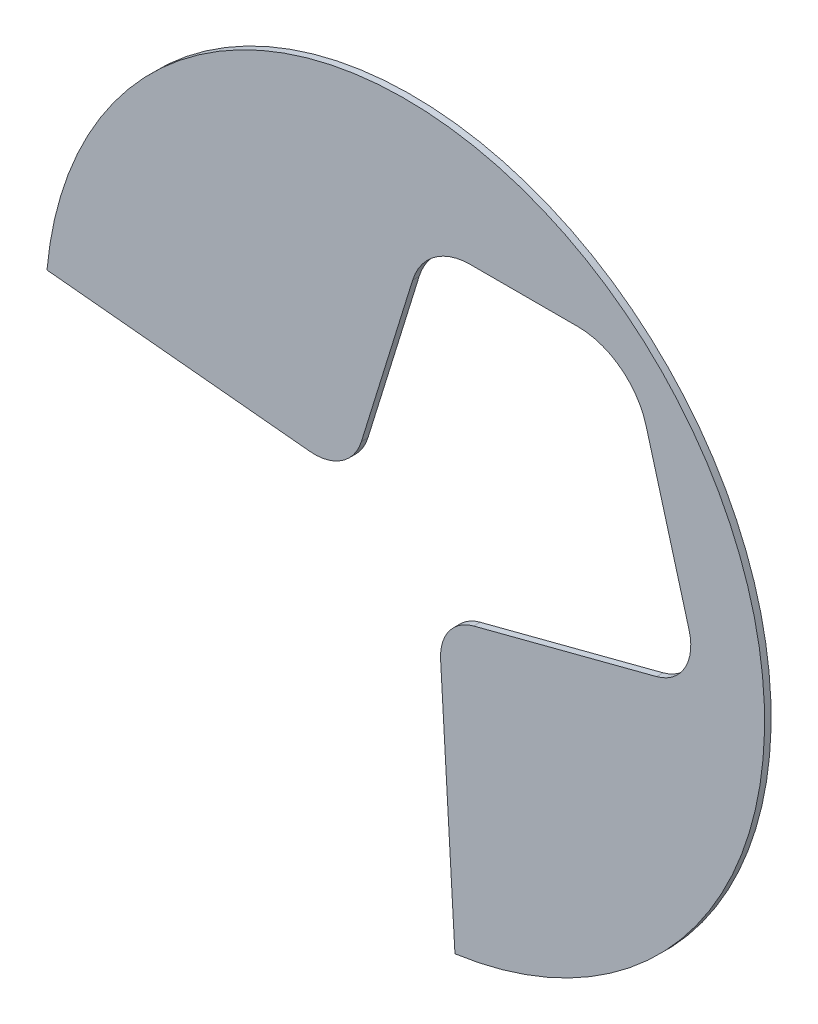
ISO-10303-21;
HEADER;
FILE_DESCRIPTION(('STEP AP214'),'2;1');
FILE_NAME('part.step','',(''),(''),'','','');
FILE_SCHEMA(('AUTOMOTIVE_DESIGN { 1 0 10303 214 1 1 1 1 }'));
ENDSEC;
DATA;
#1=APPLICATION_CONTEXT('core data for automotive mechanical design processes');
#2=APPLICATION_PROTOCOL_DEFINITION('international standard','automotive_design',2000,#1);
#3=PRODUCT_CONTEXT('',#1,'mechanical');
#4=PRODUCT('Part','Part','',(#3));
#5=PRODUCT_RELATED_PRODUCT_CATEGORY('part','',(#4));
#6=PRODUCT_DEFINITION_FORMATION('','',#4);
#7=PRODUCT_DEFINITION_CONTEXT('part definition',#1,'design');
#8=PRODUCT_DEFINITION('design','',#6,#7);
#9=PRODUCT_DEFINITION_SHAPE('','',#8);
#10=(LENGTH_UNIT() NAMED_UNIT(*) SI_UNIT(.MILLI.,.METRE.));
#11=(NAMED_UNIT(*) PLANE_ANGLE_UNIT() SI_UNIT($,.RADIAN.));
#12=(NAMED_UNIT(*) SI_UNIT($,.STERADIAN.) SOLID_ANGLE_UNIT());
#13=UNCERTAINTY_MEASURE_WITH_UNIT(LENGTH_MEASURE(1.E-05),#10,'distance_accuracy_value','');
#14=(GEOMETRIC_REPRESENTATION_CONTEXT(3) GLOBAL_UNCERTAINTY_ASSIGNED_CONTEXT((#13)) GLOBAL_UNIT_ASSIGNED_CONTEXT((#10,
#11,#12)) REPRESENTATION_CONTEXT('',''));
#15=CARTESIAN_POINT('',(0.,0.,0.));
#16=DIRECTION('',(0.,0.,1.));
#17=DIRECTION('',(1.,0.,0.));
#18=AXIS2_PLACEMENT_3D('',#15,#16,#17);
#19=CARTESIAN_POINT('',(1.415323871833,-20.5614263911,0.01));
#20=DIRECTION('',(0.,0.,1.));
#21=DIRECTION('',(1.,0.,0.));
#22=AXIS2_PLACEMENT_3D('',#19,#20,#21);
#23=PLANE('',#22);
#24=CARTESIAN_POINT('',(1.447148092672,-20.80032690544,0.01));
#25=DIRECTION('',(0.,0.,1.));
#26=DIRECTION('',(1.,0.,0.));
#27=AXIS2_PLACEMENT_3D('',#24,#25,#26);
#28=CIRCLE('',#27,0.0677382198574);
#29=CARTESIAN_POINT('',(1.4300742619,-20.73477577477,0.01));
#30=VERTEX_POINT('',#29);
#31=CARTESIAN_POINT('',(1.379523394206,-20.80424692926,0.01));
#32=VERTEX_POINT('',#31);
#33=EDGE_CURVE('E150',#30,#32,#28,.T.);
#34=ORIENTED_EDGE('',*,*,#33,.T.);
#35=DIRECTION('',(-0.0578701925266239,0.998324116115068,0.));
#36=VECTOR('',#35,1.);
#37=CARTESIAN_POINT('',(1.40147469185,-21.18293082266,0.01));
#38=LINE('',#37,#36);
#39=CARTESIAN_POINT('',(1.40147469185,-21.18293082266,0.01));
#40=VERTEX_POINT('',#39);
#41=EDGE_CURVE('E181',#40,#32,#38,.T.);
#42=ORIENTED_EDGE('',*,*,#41,.F.);
#43=CARTESIAN_POINT('',(1.325239510182,-20.63879433854,0.01));
#44=DIRECTION('',(0.,0.,1.));
#45=DIRECTION('',(1.,0.,0.));
#46=AXIS2_PLACEMENT_3D('',#43,#44,#45);
#47=CIRCLE('',#46,0.549450922539);
#48=CARTESIAN_POINT('',(0.777986222644,-20.58970100338,0.01));
#49=VERTEX_POINT('',#48);
#50=EDGE_CURVE('E197',#40,#49,#47,.T.);
#51=ORIENTED_EDGE('',*,*,#50,.T.);
#52=DIRECTION('',(0.995287122010985,-0.0969718761244285,0.));
#53=VECTOR('',#52,1.);
#54=CARTESIAN_POINT('',(0.777986222644,-20.58970100338,0.01));
#55=LINE('',#54,#53);
#56=CARTESIAN_POINT('',(1.179742413252,-20.62884453361,0.01));
#57=VERTEX_POINT('',#56);
#58=EDGE_CURVE('E159',#49,#57,#55,.T.);
#59=ORIENTED_EDGE('',*,*,#58,.T.);
#60=CARTESIAN_POINT('',(1.186997900889,-20.55437661881,0.01));
#61=DIRECTION('',(0.,0.,1.));
#62=DIRECTION('',(1.,0.,0.));
#63=AXIS2_PLACEMENT_3D('',#60,#61,#62);
#64=CIRCLE('',#63,0.07482053485309);
#65=CARTESIAN_POINT('',(1.25846926772,-20.57651157214,0.01));
#66=VERTEX_POINT('',#65);
#67=EDGE_CURVE('E168',#57,#66,#64,.T.);
#68=ORIENTED_EDGE('',*,*,#67,.T.);
#69=DIRECTION('',(-0.295840618854031,-0.955237315140099,0.));
#70=VECTOR('',#69,1.);
#71=CARTESIAN_POINT('',(1.336823182696,-20.32351526737,0.01));
#72=LINE('',#71,#70);
#73=CARTESIAN_POINT('',(1.336823182696,-20.32351526737,0.01));
#74=VERTEX_POINT('',#73);
#75=EDGE_CURVE('E211',#74,#66,#72,.T.);
#76=ORIENTED_EDGE('',*,*,#75,.F.);
#77=CARTESIAN_POINT('',(1.424508766586,-20.35067182521,0.01));
#78=DIRECTION('',(0.,0.,1.));
#79=DIRECTION('',(1.,0.,0.));
#80=AXIS2_PLACEMENT_3D('',#77,#78,#79);
#81=CIRCLE('',#80,0.09179455460972);
#82=CARTESIAN_POINT('',(1.424508766586,-20.2588772706,0.01));
#83=VERTEX_POINT('',#82);
#84=EDGE_CURVE('E221',#83,#74,#81,.T.);
#85=ORIENTED_EDGE('',*,*,#84,.F.);
#86=DIRECTION('',(-1.,0.,0.));
#87=VECTOR('',#86,1.);
#88=CARTESIAN_POINT('',(1.589299866222,-20.2588772706,0.01));
#89=LINE('',#88,#87);
#90=CARTESIAN_POINT('',(1.589299866222,-20.2588772706,0.01));
#91=VERTEX_POINT('',#90);
#92=EDGE_CURVE('E231',#91,#83,#89,.T.);
#93=ORIENTED_EDGE('',*,*,#92,.F.);
#94=CARTESIAN_POINT('',(1.589299866222,-20.36721392306,0.01));
#95=DIRECTION('',(0.,0.,1.));
#96=DIRECTION('',(1.,0.,0.));
#97=AXIS2_PLACEMENT_3D('',#94,#95,#96);
#98=CIRCLE('',#97,0.108336652462);
#99=CARTESIAN_POINT('',(1.693716591398,-20.33833524978,0.01));
#100=VERTEX_POINT('',#99);
#101=EDGE_CURVE('E241',#100,#91,#98,.T.);
#102=ORIENTED_EDGE('',*,*,#101,.F.);
#103=DIRECTION('',(-0.266564201686126,0.963817164393454,0.));
#104=VECTOR('',#103,1.);
#105=CARTESIAN_POINT('',(1.759371974397,-20.57572565956,0.01));
#106=LINE('',#105,#104);
#107=CARTESIAN_POINT('',(1.759371974397,-20.57572565956,0.01));
#108=VERTEX_POINT('',#107);
#109=EDGE_CURVE('E251',#108,#100,#106,.T.);
#110=ORIENTED_EDGE('',*,*,#109,.F.);
#111=CARTESIAN_POINT('',(1.692035999147,-20.59434886026,0.01));
#112=DIRECTION('',(0.,0.,1.));
#113=DIRECTION('',(1.,0.,0.));
#114=AXIS2_PLACEMENT_3D('',#111,#112,#113);
#115=CIRCLE('',#114,0.0698638473541);
#116=CARTESIAN_POINT('',(1.709645607273,-20.6619569875,0.01));
#117=VERTEX_POINT('',#116);
#118=EDGE_CURVE('E177',#117,#108,#115,.T.);
#119=ORIENTED_EDGE('',*,*,#118,.F.);
#120=DIRECTION('',(0.967712626765857,0.252056088991963,0.));
#121=VECTOR('',#120,1.);
#122=CARTESIAN_POINT('',(1.4300742619,-20.73477577477,0.01));
#123=LINE('',#122,#121);
#124=EDGE_CURVE('E25',#30,#117,#123,.T.);
#125=ORIENTED_EDGE('',*,*,#124,.F.);
#126=EDGE_LOOP('',(#34,#42,#51,#59,#68,#76,#85,#93,#102,#110,#119,#125));
#127=FACE_BOUND('',#126,.T.);
#128=ADVANCED_FACE('F17',(#127),#23,.T.);
#129=CARTESIAN_POINT('',(1.415323871833,-20.5614263911,0.));
#130=DIRECTION('',(0.,0.,1.));
#131=DIRECTION('',(1.,0.,0.));
#132=AXIS2_PLACEMENT_3D('',#129,#130,#131);
#133=PLANE('',#132);
#134=CARTESIAN_POINT('',(1.447148092672,-20.80032690544,0.));
#135=DIRECTION('',(0.,0.,1.));
#136=DIRECTION('',(1.,0.,0.));
#137=AXIS2_PLACEMENT_3D('',#134,#135,#136);
#138=CIRCLE('',#137,0.0677382198574);
#139=CARTESIAN_POINT('',(1.4300742619,-20.73477577477,0.));
#140=VERTEX_POINT('',#139);
#141=CARTESIAN_POINT('',(1.379523394206,-20.80424692926,0.));
#142=VERTEX_POINT('',#141);
#143=EDGE_CURVE('E137',#140,#142,#138,.T.);
#144=ORIENTED_EDGE('',*,*,#143,.F.);
#145=DIRECTION('',(0.967712626765857,0.252056088991963,0.));
#146=VECTOR('',#145,1.);
#147=CARTESIAN_POINT('',(1.4300742619,-20.73477577477,0.));
#148=LINE('',#147,#146);
#149=CARTESIAN_POINT('',(1.709645607273,-20.6619569875,0.));
#150=VERTEX_POINT('',#149);
#151=EDGE_CURVE('E11',#140,#150,#148,.T.);
#152=ORIENTED_EDGE('',*,*,#151,.T.);
#153=CARTESIAN_POINT('',(1.692035999147,-20.59434886026,0.));
#154=DIRECTION('',(0.,0.,1.));
#155=DIRECTION('',(1.,0.,0.));
#156=AXIS2_PLACEMENT_3D('',#153,#154,#155);
#157=CIRCLE('',#156,0.0698638473541);
#158=CARTESIAN_POINT('',(1.759371974397,-20.57572565956,0.));
#159=VERTEX_POINT('',#158);
#160=EDGE_CURVE('E174',#150,#159,#157,.T.);
#161=ORIENTED_EDGE('',*,*,#160,.T.);
#162=DIRECTION('',(-0.266564201686126,0.963817164393454,0.));
#163=VECTOR('',#162,1.);
#164=CARTESIAN_POINT('',(1.759371974397,-20.57572565956,0.));
#165=LINE('',#164,#163);
#166=CARTESIAN_POINT('',(1.693716591398,-20.33833524978,0.));
#167=VERTEX_POINT('',#166);
#168=EDGE_CURVE('E254',#159,#167,#165,.T.);
#169=ORIENTED_EDGE('',*,*,#168,.T.);
#170=CARTESIAN_POINT('',(1.589299866222,-20.36721392306,0.));
#171=DIRECTION('',(0.,0.,1.));
#172=DIRECTION('',(1.,0.,0.));
#173=AXIS2_PLACEMENT_3D('',#170,#171,#172);
#174=CIRCLE('',#173,0.108336652462);
#175=CARTESIAN_POINT('',(1.589299866222,-20.2588772706,0.));
#176=VERTEX_POINT('',#175);
#177=EDGE_CURVE('E244',#167,#176,#174,.T.);
#178=ORIENTED_EDGE('',*,*,#177,.T.);
#179=DIRECTION('',(-1.,0.,0.));
#180=VECTOR('',#179,1.);
#181=CARTESIAN_POINT('',(1.589299866222,-20.2588772706,0.));
#182=LINE('',#181,#180);
#183=CARTESIAN_POINT('',(1.424508766586,-20.2588772706,0.));
#184=VERTEX_POINT('',#183);
#185=EDGE_CURVE('E234',#176,#184,#182,.T.);
#186=ORIENTED_EDGE('',*,*,#185,.T.);
#187=CARTESIAN_POINT('',(1.424508766586,-20.35067182521,0.));
#188=DIRECTION('',(0.,0.,1.));
#189=DIRECTION('',(1.,0.,0.));
#190=AXIS2_PLACEMENT_3D('',#187,#188,#189);
#191=CIRCLE('',#190,0.09179455460972);
#192=CARTESIAN_POINT('',(1.336823182696,-20.32351526737,0.));
#193=VERTEX_POINT('',#192);
#194=EDGE_CURVE('E224',#184,#193,#191,.T.);
#195=ORIENTED_EDGE('',*,*,#194,.T.);
#196=DIRECTION('',(-0.295840618854031,-0.955237315140099,0.));
#197=VECTOR('',#196,1.);
#198=CARTESIAN_POINT('',(1.336823182696,-20.32351526737,0.));
#199=LINE('',#198,#197);
#200=CARTESIAN_POINT('',(1.25846926772,-20.57651157214,0.));
#201=VERTEX_POINT('',#200);
#202=EDGE_CURVE('E214',#193,#201,#199,.T.);
#203=ORIENTED_EDGE('',*,*,#202,.T.);
#204=CARTESIAN_POINT('',(1.186997900889,-20.55437661881,0.));
#205=DIRECTION('',(0.,0.,1.));
#206=DIRECTION('',(1.,0.,0.));
#207=AXIS2_PLACEMENT_3D('',#204,#205,#206);
#208=CIRCLE('',#207,0.07482053485309);
#209=CARTESIAN_POINT('',(1.179742413252,-20.62884453361,0.));
#210=VERTEX_POINT('',#209);
#211=EDGE_CURVE('E161',#210,#201,#208,.T.);
#212=ORIENTED_EDGE('',*,*,#211,.F.);
#213=DIRECTION('',(0.995287122010985,-0.0969718761244285,0.));
#214=VECTOR('',#213,1.);
#215=CARTESIAN_POINT('',(0.777986222644,-20.58970100338,0.));
#216=LINE('',#215,#214);
#217=CARTESIAN_POINT('',(0.777986222644,-20.58970100338,0.));
#218=VERTEX_POINT('',#217);
#219=EDGE_CURVE('E201',#218,#210,#216,.T.);
#220=ORIENTED_EDGE('',*,*,#219,.F.);
#221=CARTESIAN_POINT('',(1.325239510182,-20.63879433854,0.));
#222=DIRECTION('',(0.,0.,1.));
#223=DIRECTION('',(1.,0.,0.));
#224=AXIS2_PLACEMENT_3D('',#221,#222,#223);
#225=CIRCLE('',#224,0.549450922539);
#226=CARTESIAN_POINT('',(1.40147469185,-21.18293082266,0.));
#227=VERTEX_POINT('',#226);
#228=EDGE_CURVE('E186',#227,#218,#225,.T.);
#229=ORIENTED_EDGE('',*,*,#228,.F.);
#230=DIRECTION('',(-0.0578701925266239,0.998324116115068,0.));
#231=VECTOR('',#230,1.);
#232=CARTESIAN_POINT('',(1.40147469185,-21.18293082266,0.));
#233=LINE('',#232,#231);
#234=EDGE_CURVE('E140',#227,#142,#233,.T.);
#235=ORIENTED_EDGE('',*,*,#234,.T.);
#236=EDGE_LOOP('',(#144,#152,#161,#169,#178,#186,#195,#203,#212,#220,#229,#235));
#237=FACE_BOUND('',#236,.T.);
#238=ADVANCED_FACE('F138',(#237),#133,.F.);
#239=CARTESIAN_POINT('',(1.4300742619,-20.73477577477,0.));
#240=DIRECTION('',(-0.252056088991963,0.967712626765858,0.));
#241=DIRECTION('',(0.,0.,1.));
#242=AXIS2_PLACEMENT_3D('',#239,#240,#241);
#243=PLANE('',#242);
#244=DIRECTION('',(0.,0.,1.));
#245=VECTOR('',#244,1.);
#246=CARTESIAN_POINT('',(1.4300742619,-20.73477577477,0.));
#247=LINE('',#246,#245);
#248=EDGE_CURVE('E133',#140,#30,#247,.T.);
#249=ORIENTED_EDGE('',*,*,#248,.T.);
#250=ORIENTED_EDGE('',*,*,#124,.T.);
#251=DIRECTION('',(0.,0.,1.));
#252=VECTOR('',#251,1.);
#253=CARTESIAN_POINT('',(1.709645607273,-20.6619569875,0.));
#254=LINE('',#253,#252);
#255=EDGE_CURVE('E135',#150,#117,#254,.T.);
#256=ORIENTED_EDGE('',*,*,#255,.F.);
#257=ORIENTED_EDGE('',*,*,#151,.F.);
#258=EDGE_LOOP('',(#249,#250,#256,#257));
#259=FACE_BOUND('',#258,.T.);
#260=ADVANCED_FACE('F131',(#259),#243,.T.);
#261=CARTESIAN_POINT('',(1.692035999147,-20.59434886026,0.));
#262=DIRECTION('',(0.,0.,-1.));
#263=DIRECTION('',(1.,0.,0.));
#264=AXIS2_PLACEMENT_3D('',#261,#262,#263);
#265=CYLINDRICAL_SURFACE('',#264,0.0698638473541);
#266=ORIENTED_EDGE('',*,*,#255,.T.);
#267=ORIENTED_EDGE('',*,*,#118,.T.);
#268=DIRECTION('',(0.,0.,1.));
#269=VECTOR('',#268,1.);
#270=CARTESIAN_POINT('',(1.759371974397,-20.57572565956,0.));
#271=LINE('',#270,#269);
#272=EDGE_CURVE('E247',#159,#108,#271,.T.);
#273=ORIENTED_EDGE('',*,*,#272,.F.);
#274=ORIENTED_EDGE('',*,*,#160,.F.);
#275=EDGE_LOOP('',(#266,#267,#273,#274));
#276=FACE_BOUND('',#275,.T.);
#277=ADVANCED_FACE('F299',(#276),#265,.F.);
#278=CARTESIAN_POINT('',(1.759371974397,-20.57572565956,0.));
#279=DIRECTION('',(-0.963817164393454,-0.266564201686126,0.));
#280=DIRECTION('',(-0.266564201686126,0.963817164393454,0.));
#281=AXIS2_PLACEMENT_3D('',#278,#279,#280);
#282=PLANE('',#281);
#283=ORIENTED_EDGE('',*,*,#272,.T.);
#284=ORIENTED_EDGE('',*,*,#109,.T.);
#285=DIRECTION('',(0.,0.,1.));
#286=VECTOR('',#285,1.);
#287=CARTESIAN_POINT('',(1.693716591398,-20.33833524978,0.));
#288=LINE('',#287,#286);
#289=EDGE_CURVE('E237',#167,#100,#288,.T.);
#290=ORIENTED_EDGE('',*,*,#289,.F.);
#291=ORIENTED_EDGE('',*,*,#168,.F.);
#292=EDGE_LOOP('',(#283,#284,#290,#291));
#293=FACE_BOUND('',#292,.T.);
#294=ADVANCED_FACE('F353',(#293),#282,.T.);
#295=CARTESIAN_POINT('',(1.589299866222,-20.36721392306,0.));
#296=DIRECTION('',(0.,0.,-1.));
#297=DIRECTION('',(1.,0.,0.));
#298=AXIS2_PLACEMENT_3D('',#295,#296,#297);
#299=CYLINDRICAL_SURFACE('',#298,0.108336652462);
#300=ORIENTED_EDGE('',*,*,#289,.T.);
#301=ORIENTED_EDGE('',*,*,#101,.T.);
#302=DIRECTION('',(0.,0.,1.));
#303=VECTOR('',#302,1.);
#304=CARTESIAN_POINT('',(1.589299866222,-20.2588772706,0.));
#305=LINE('',#304,#303);
#306=EDGE_CURVE('E227',#176,#91,#305,.T.);
#307=ORIENTED_EDGE('',*,*,#306,.F.);
#308=ORIENTED_EDGE('',*,*,#177,.F.);
#309=EDGE_LOOP('',(#300,#301,#307,#308));
#310=FACE_BOUND('',#309,.T.);
#311=ADVANCED_FACE('F344',(#310),#299,.F.);
#312=CARTESIAN_POINT('',(1.589299866222,-20.2588772706,0.));
#313=DIRECTION('',(0.,-1.,0.));
#314=DIRECTION('',(0.,0.,-1.));
#315=AXIS2_PLACEMENT_3D('',#312,#313,#314);
#316=PLANE('',#315);
#317=ORIENTED_EDGE('',*,*,#306,.T.);
#318=ORIENTED_EDGE('',*,*,#92,.T.);
#319=DIRECTION('',(0.,0.,1.));
#320=VECTOR('',#319,1.);
#321=CARTESIAN_POINT('',(1.424508766586,-20.2588772706,0.));
#322=LINE('',#321,#320);
#323=EDGE_CURVE('E217',#184,#83,#322,.T.);
#324=ORIENTED_EDGE('',*,*,#323,.F.);
#325=ORIENTED_EDGE('',*,*,#185,.F.);
#326=EDGE_LOOP('',(#317,#318,#324,#325));
#327=FACE_BOUND('',#326,.T.);
#328=ADVANCED_FACE('F335',(#327),#316,.T.);
#329=CARTESIAN_POINT('',(1.424508766586,-20.35067182521,0.));
#330=DIRECTION('',(0.,0.,-1.));
#331=DIRECTION('',(1.,0.,0.));
#332=AXIS2_PLACEMENT_3D('',#329,#330,#331);
#333=CYLINDRICAL_SURFACE('',#332,0.09179455460972);
#334=ORIENTED_EDGE('',*,*,#323,.T.);
#335=ORIENTED_EDGE('',*,*,#84,.T.);
#336=DIRECTION('',(0.,0.,1.));
#337=VECTOR('',#336,1.);
#338=CARTESIAN_POINT('',(1.336823182696,-20.32351526737,0.));
#339=LINE('',#338,#337);
#340=EDGE_CURVE('E158',#193,#74,#339,.T.);
#341=ORIENTED_EDGE('',*,*,#340,.F.);
#342=ORIENTED_EDGE('',*,*,#194,.F.);
#343=EDGE_LOOP('',(#334,#335,#341,#342));
#344=FACE_BOUND('',#343,.T.);
#345=ADVANCED_FACE('F326',(#344),#333,.F.);
#346=CARTESIAN_POINT('',(1.336823182696,-20.32351526737,0.));
#347=DIRECTION('',(0.955237315140099,-0.295840618854031,0.));
#348=DIRECTION('',(0.,0.,-1.));
#349=AXIS2_PLACEMENT_3D('',#346,#347,#348);
#350=PLANE('',#349);
#351=ORIENTED_EDGE('',*,*,#340,.T.);
#352=ORIENTED_EDGE('',*,*,#75,.T.);
#353=DIRECTION('',(0.,0.,1.));
#354=VECTOR('',#353,1.);
#355=CARTESIAN_POINT('',(1.25846926772,-20.57651157214,0.));
#356=LINE('',#355,#354);
#357=EDGE_CURVE('E164',#201,#66,#356,.T.);
#358=ORIENTED_EDGE('',*,*,#357,.F.);
#359=ORIENTED_EDGE('',*,*,#202,.F.);
#360=EDGE_LOOP('',(#351,#352,#358,#359));
#361=FACE_BOUND('',#360,.T.);
#362=ADVANCED_FACE('F317',(#361),#350,.T.);
#363=CARTESIAN_POINT('',(1.186997900889,-20.55437661881,0.));
#364=DIRECTION('',(0.,0.,-1.));
#365=DIRECTION('',(1.,0.,0.));
#366=AXIS2_PLACEMENT_3D('',#363,#364,#365);
#367=CYLINDRICAL_SURFACE('',#366,0.07482053485309);
#368=DIRECTION('',(0.,0.,1.));
#369=VECTOR('',#368,1.);
#370=CARTESIAN_POINT('',(1.179742413252,-20.62884453361,0.));
#371=LINE('',#370,#369);
#372=EDGE_CURVE('E162',#210,#57,#371,.T.);
#373=ORIENTED_EDGE('',*,*,#372,.F.);
#374=ORIENTED_EDGE('',*,*,#211,.T.);
#375=ORIENTED_EDGE('',*,*,#357,.T.);
#376=ORIENTED_EDGE('',*,*,#67,.F.);
#377=EDGE_LOOP('',(#373,#374,#375,#376));
#378=FACE_BOUND('',#377,.T.);
#379=ADVANCED_FACE('F308',(#378),#367,.T.);
#380=CARTESIAN_POINT('',(0.777986222644,-20.58970100338,0.));
#381=DIRECTION('',(0.0969718761244285,0.995287122010985,0.));
#382=DIRECTION('',(0.,0.,-1.));
#383=AXIS2_PLACEMENT_3D('',#380,#381,#382);
#384=PLANE('',#383);
#385=DIRECTION('',(0.,0.,1.));
#386=VECTOR('',#385,1.);
#387=CARTESIAN_POINT('',(0.777986222644,-20.58970100338,0.));
#388=LINE('',#387,#386);
#389=EDGE_CURVE('E190',#218,#49,#388,.T.);
#390=ORIENTED_EDGE('',*,*,#389,.F.);
#391=ORIENTED_EDGE('',*,*,#219,.T.);
#392=ORIENTED_EDGE('',*,*,#372,.T.);
#393=ORIENTED_EDGE('',*,*,#58,.F.);
#394=EDGE_LOOP('',(#390,#391,#392,#393));
#395=FACE_BOUND('',#394,.T.);
#396=ADVANCED_FACE('F282',(#395),#384,.F.);
#397=CARTESIAN_POINT('',(1.325239510182,-20.63879433854,0.));
#398=DIRECTION('',(0.,0.,-1.));
#399=DIRECTION('',(1.,0.,0.));
#400=AXIS2_PLACEMENT_3D('',#397,#398,#399);
#401=CYLINDRICAL_SURFACE('',#400,0.549450922539);
#402=DIRECTION('',(0.,0.,1.));
#403=VECTOR('',#402,1.);
#404=CARTESIAN_POINT('',(1.40147469185,-21.18293082266,0.));
#405=LINE('',#404,#403);
#406=EDGE_CURVE('E173',#227,#40,#405,.T.);
#407=ORIENTED_EDGE('',*,*,#406,.F.);
#408=ORIENTED_EDGE('',*,*,#228,.T.);
#409=ORIENTED_EDGE('',*,*,#389,.T.);
#410=ORIENTED_EDGE('',*,*,#50,.F.);
#411=EDGE_LOOP('',(#407,#408,#409,#410));
#412=FACE_BOUND('',#411,.T.);
#413=ADVANCED_FACE('F277',(#412),#401,.T.);
#414=CARTESIAN_POINT('',(1.40147469185,-21.18293082266,0.));
#415=DIRECTION('',(-0.998324116115068,-0.0578701925266239,0.));
#416=DIRECTION('',(-0.0578701925266239,0.998324116115068,0.));
#417=AXIS2_PLACEMENT_3D('',#414,#415,#416);
#418=PLANE('',#417);
#419=ORIENTED_EDGE('',*,*,#406,.T.);
#420=ORIENTED_EDGE('',*,*,#41,.T.);
#421=DIRECTION('',(0.,0.,1.));
#422=VECTOR('',#421,1.);
#423=CARTESIAN_POINT('',(1.379523394206,-20.80424692926,0.));
#424=LINE('',#423,#422);
#425=EDGE_CURVE('E145',#142,#32,#424,.T.);
#426=ORIENTED_EDGE('',*,*,#425,.F.);
#427=ORIENTED_EDGE('',*,*,#234,.F.);
#428=EDGE_LOOP('',(#419,#420,#426,#427));
#429=FACE_BOUND('',#428,.T.);
#430=ADVANCED_FACE('F271',(#429),#418,.T.);
#431=CARTESIAN_POINT('',(1.447148092672,-20.80032690544,0.));
#432=DIRECTION('',(0.,0.,-1.));
#433=DIRECTION('',(-0.808589941876326,0.588372591047917,0.));
#434=AXIS2_PLACEMENT_3D('',#431,#432,#433);
#435=CYLINDRICAL_SURFACE('',#434,0.0677382198574);
#436=ORIENTED_EDGE('',*,*,#248,.F.);
#437=ORIENTED_EDGE('',*,*,#143,.T.);
#438=ORIENTED_EDGE('',*,*,#425,.T.);
#439=ORIENTED_EDGE('',*,*,#33,.F.);
#440=EDGE_LOOP('',(#436,#437,#438,#439));
#441=FACE_BOUND('',#440,.T.);
#442=ADVANCED_FACE('F148',(#441),#435,.T.);
#443=CLOSED_SHELL('',(#128,#238,#260,#277,#294,#311,#328,#345,#362,#379,#396,#413,#430,#442));
#444=MANIFOLD_SOLID_BREP('B1',#443);
#445=ADVANCED_BREP_SHAPE_REPRESENTATION('',(#18,#444),#14);
#446=SHAPE_DEFINITION_REPRESENTATION(#9,#445);
ENDSEC;
END-ISO-10303-21;
